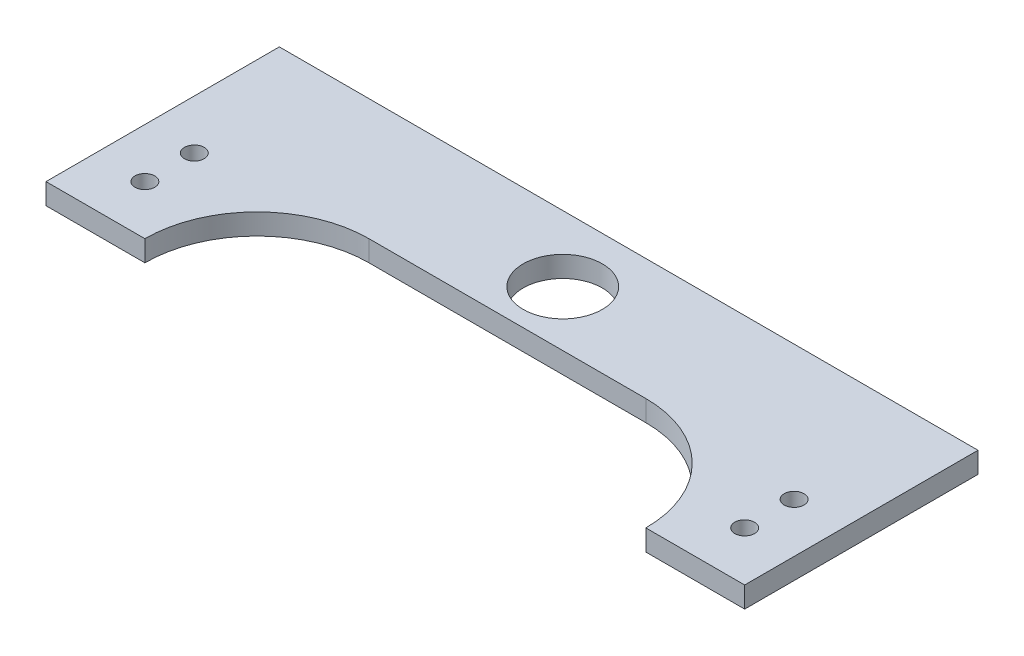
ISO-10303-21;
HEADER;
FILE_DESCRIPTION(('STEP AP214'),'2;1');
FILE_NAME('part.step','',(''),(''),'','','');
FILE_SCHEMA(('AUTOMOTIVE_DESIGN { 1 0 10303 214 1 1 1 1 }'));
ENDSEC;
DATA;
#1=APPLICATION_CONTEXT('core data for automotive mechanical design processes');
#2=APPLICATION_PROTOCOL_DEFINITION('international standard','automotive_design',2000,#1);
#3=PRODUCT_CONTEXT('',#1,'mechanical');
#4=PRODUCT('Part','Part','',(#3));
#5=PRODUCT_RELATED_PRODUCT_CATEGORY('part','',(#4));
#6=PRODUCT_DEFINITION_FORMATION('','',#4);
#7=PRODUCT_DEFINITION_CONTEXT('part definition',#1,'design');
#8=PRODUCT_DEFINITION('design','',#6,#7);
#9=PRODUCT_DEFINITION_SHAPE('','',#8);
#10=(LENGTH_UNIT() NAMED_UNIT(*) SI_UNIT(.MILLI.,.METRE.));
#11=(NAMED_UNIT(*) PLANE_ANGLE_UNIT() SI_UNIT($,.RADIAN.));
#12=(NAMED_UNIT(*) SI_UNIT($,.STERADIAN.) SOLID_ANGLE_UNIT());
#13=UNCERTAINTY_MEASURE_WITH_UNIT(LENGTH_MEASURE(1.E-05),#10,'distance_accuracy_value','');
#14=(GEOMETRIC_REPRESENTATION_CONTEXT(3) GLOBAL_UNCERTAINTY_ASSIGNED_CONTEXT((#13)) GLOBAL_UNIT_ASSIGNED_CONTEXT((#10,
#11,#12)) REPRESENTATION_CONTEXT('',''));
#15=CARTESIAN_POINT('',(0.,0.,0.));
#16=DIRECTION('',(0.,0.,1.));
#17=DIRECTION('',(1.,0.,0.));
#18=AXIS2_PLACEMENT_3D('',#15,#16,#17);
#19=CARTESIAN_POINT('',(0.,3.175,0.));
#20=DIRECTION('',(0.,1.,0.));
#21=DIRECTION('',(0.,0.,1.));
#22=AXIS2_PLACEMENT_3D('',#19,#20,#21);
#23=PLANE('',#22);
#24=CARTESIAN_POINT('',(7.5,3.175,-7.5));
#25=DIRECTION('',(0.,-1.,0.));
#26=DIRECTION('',(0.,0.,-1.));
#27=AXIS2_PLACEMENT_3D('',#24,#25,#26);
#28=CIRCLE('',#27,1.5);
#29=CARTESIAN_POINT('',(7.5,3.175,-9.));
#30=VERTEX_POINT('',#29);
#31=EDGE_CURVE('E378',#30,#30,#28,.T.);
#32=ORIENTED_EDGE('',*,*,#31,.T.);
#33=EDGE_LOOP('',(#32));
#34=FACE_BOUND('',#33,.T.);
#35=CARTESIAN_POINT('',(98.5,3.175,-15.));
#36=DIRECTION('',(0.,-1.,0.));
#37=DIRECTION('',(0.,0.,-1.));
#38=AXIS2_PLACEMENT_3D('',#35,#36,#37);
#39=CIRCLE('',#38,1.5);
#40=CARTESIAN_POINT('',(98.5,3.175,-16.5));
#41=VERTEX_POINT('',#40);
#42=EDGE_CURVE('E397',#41,#41,#39,.F.);
#43=ORIENTED_EDGE('',*,*,#42,.F.);
#44=EDGE_LOOP('',(#43));
#45=FACE_BOUND('',#44,.T.);
#46=CARTESIAN_POINT('',(7.5,3.175,-15.));
#47=DIRECTION('',(0.,-1.,0.));
#48=DIRECTION('',(0.,0.,-1.));
#49=AXIS2_PLACEMENT_3D('',#46,#47,#48);
#50=CIRCLE('',#49,1.5);
#51=CARTESIAN_POINT('',(7.5,3.175,-16.5));
#52=VERTEX_POINT('',#51);
#53=EDGE_CURVE('E136',#52,#52,#50,.T.);
#54=ORIENTED_EDGE('',*,*,#53,.T.);
#55=EDGE_LOOP('',(#54));
#56=FACE_BOUND('',#55,.T.);
#57=DIRECTION('',(1.,0.,0.));
#58=VECTOR('',#57,1.);
#59=CARTESIAN_POINT('',(0.,3.175,-35.4));
#60=LINE('',#59,#58);
#61=CARTESIAN_POINT('',(0.,3.175,-35.4));
#62=VERTEX_POINT('',#61);
#63=CARTESIAN_POINT('',(106.,3.175,-35.4));
#64=VERTEX_POINT('',#63);
#65=EDGE_CURVE('E155',#62,#64,#60,.T.);
#66=ORIENTED_EDGE('',*,*,#65,.F.);
#67=DIRECTION('',(0.,0.,-1.));
#68=VECTOR('',#67,1.);
#69=CARTESIAN_POINT('',(0.,3.175,0.));
#70=LINE('',#69,#68);
#71=CARTESIAN_POINT('',(0.,3.175,0.));
#72=VERTEX_POINT('',#71);
#73=EDGE_CURVE('E178',#72,#62,#70,.T.);
#74=ORIENTED_EDGE('',*,*,#73,.F.);
#75=DIRECTION('',(1.,0.,0.));
#76=VECTOR('',#75,1.);
#77=CARTESIAN_POINT('',(0.,3.175,0.));
#78=LINE('',#77,#76);
#79=CARTESIAN_POINT('',(15.,3.175,0.));
#80=VERTEX_POINT('',#79);
#81=EDGE_CURVE('E167',#72,#80,#78,.T.);
#82=ORIENTED_EDGE('',*,*,#81,.T.);
#83=CARTESIAN_POINT('',(32.,3.175,0.));
#84=DIRECTION('',(0.,1.,0.));
#85=DIRECTION('',(0.,0.,1.));
#86=AXIS2_PLACEMENT_3D('',#83,#84,#85);
#87=CIRCLE('',#86,17.);
#88=CARTESIAN_POINT('',(32.,3.175,-17.));
#89=VERTEX_POINT('',#88);
#90=EDGE_CURVE('E124',#89,#80,#87,.T.);
#91=ORIENTED_EDGE('',*,*,#90,.F.);
#92=DIRECTION('',(1.,0.,0.));
#93=VECTOR('',#92,1.);
#94=CARTESIAN_POINT('',(0.,3.175,-17.));
#95=LINE('',#94,#93);
#96=CARTESIAN_POINT('',(74.,3.175,-17.));
#97=VERTEX_POINT('',#96);
#98=EDGE_CURVE('E121',#89,#97,#95,.T.);
#99=ORIENTED_EDGE('',*,*,#98,.T.);
#100=CARTESIAN_POINT('',(74.,3.175,0.));
#101=DIRECTION('',(0.,1.,0.));
#102=DIRECTION('',(0.,0.,1.));
#103=AXIS2_PLACEMENT_3D('',#100,#101,#102);
#104=CIRCLE('',#103,17.);
#105=CARTESIAN_POINT('',(91.,3.175,0.));
#106=VERTEX_POINT('',#105);
#107=EDGE_CURVE('E109',#106,#97,#104,.T.);
#108=ORIENTED_EDGE('',*,*,#107,.F.);
#109=DIRECTION('',(1.,0.,0.));
#110=VECTOR('',#109,1.);
#111=CARTESIAN_POINT('',(0.,3.175,0.));
#112=LINE('',#111,#110);
#113=CARTESIAN_POINT('',(106.,3.175,0.));
#114=VERTEX_POINT('',#113);
#115=EDGE_CURVE('E115',#106,#114,#112,.T.);
#116=ORIENTED_EDGE('',*,*,#115,.T.);
#117=DIRECTION('',(0.,0.,-1.));
#118=VECTOR('',#117,1.);
#119=CARTESIAN_POINT('',(106.,3.175,0.));
#120=LINE('',#119,#118);
#121=EDGE_CURVE('E51',#114,#64,#120,.T.);
#122=ORIENTED_EDGE('',*,*,#121,.T.);
#123=EDGE_LOOP('',(#66,#74,#82,#91,#99,#108,#116,#122));
#124=FACE_BOUND('',#123,.T.);
#125=CARTESIAN_POINT('',(53.,3.175,-25.4));
#126=DIRECTION('',(0.,1.,0.));
#127=DIRECTION('',(0.,0.,1.));
#128=AXIS2_PLACEMENT_3D('',#125,#126,#127);
#129=CIRCLE('',#128,5.99999999999999);
#130=CARTESIAN_POINT('',(53.,3.175,-19.4));
#131=VERTEX_POINT('',#130);
#132=EDGE_CURVE('E129',#131,#131,#129,.T.);
#133=ORIENTED_EDGE('',*,*,#132,.F.);
#134=EDGE_LOOP('',(#133));
#135=FACE_BOUND('',#134,.T.);
#136=CARTESIAN_POINT('',(98.5,3.175,-7.5));
#137=DIRECTION('',(0.,-1.,0.));
#138=DIRECTION('',(0.,0.,-1.));
#139=AXIS2_PLACEMENT_3D('',#136,#137,#138);
#140=CIRCLE('',#139,1.5);
#141=CARTESIAN_POINT('',(98.5,3.175,-9.));
#142=VERTEX_POINT('',#141);
#143=EDGE_CURVE('E382',#142,#142,#140,.F.);
#144=ORIENTED_EDGE('',*,*,#143,.F.);
#145=EDGE_LOOP('',(#144));
#146=FACE_BOUND('',#145,.T.);
#147=ADVANCED_FACE('F34',(#34,#45,#56,#124,#135,#146),#23,.T.);
#148=CARTESIAN_POINT('',(0.,0.,0.));
#149=DIRECTION('',(0.,1.,0.));
#150=DIRECTION('',(0.,0.,1.));
#151=AXIS2_PLACEMENT_3D('',#148,#149,#150);
#152=PLANE('',#151);
#153=CARTESIAN_POINT('',(7.5,0.,-7.5));
#154=DIRECTION('',(0.,-1.,0.));
#155=DIRECTION('',(0.,0.,-1.));
#156=AXIS2_PLACEMENT_3D('',#153,#154,#155);
#157=CIRCLE('',#156,1.5);
#158=CARTESIAN_POINT('',(7.5,0.,-9.));
#159=VERTEX_POINT('',#158);
#160=EDGE_CURVE('E381',#159,#159,#157,.T.);
#161=ORIENTED_EDGE('',*,*,#160,.F.);
#162=EDGE_LOOP('',(#161));
#163=FACE_BOUND('',#162,.T.);
#164=CARTESIAN_POINT('',(7.5,0.,-15.));
#165=DIRECTION('',(0.,-1.,0.));
#166=DIRECTION('',(0.,0.,-1.));
#167=AXIS2_PLACEMENT_3D('',#164,#165,#166);
#168=CIRCLE('',#167,1.5);
#169=CARTESIAN_POINT('',(7.5,0.,-16.5));
#170=VERTEX_POINT('',#169);
#171=EDGE_CURVE('E185',#170,#170,#168,.T.);
#172=ORIENTED_EDGE('',*,*,#171,.F.);
#173=EDGE_LOOP('',(#172));
#174=FACE_BOUND('',#173,.T.);
#175=DIRECTION('',(1.,0.,0.));
#176=VECTOR('',#175,1.);
#177=CARTESIAN_POINT('',(0.,0.,-35.4));
#178=LINE('',#177,#176);
#179=CARTESIAN_POINT('',(0.,0.,-35.4));
#180=VERTEX_POINT('',#179);
#181=CARTESIAN_POINT('',(106.,0.,-35.4));
#182=VERTEX_POINT('',#181);
#183=EDGE_CURVE('E132',#180,#182,#178,.T.);
#184=ORIENTED_EDGE('',*,*,#183,.T.);
#185=DIRECTION('',(0.,0.,-1.));
#186=VECTOR('',#185,1.);
#187=CARTESIAN_POINT('',(106.,0.,0.));
#188=LINE('',#187,#186);
#189=CARTESIAN_POINT('',(106.,0.,0.));
#190=VERTEX_POINT('',#189);
#191=EDGE_CURVE('E150',#190,#182,#188,.T.);
#192=ORIENTED_EDGE('',*,*,#191,.F.);
#193=DIRECTION('',(1.,0.,0.));
#194=VECTOR('',#193,1.);
#195=CARTESIAN_POINT('',(0.,0.,0.));
#196=LINE('',#195,#194);
#197=CARTESIAN_POINT('',(91.,0.,0.));
#198=VERTEX_POINT('',#197);
#199=EDGE_CURVE('E78',#198,#190,#196,.T.);
#200=ORIENTED_EDGE('',*,*,#199,.F.);
#201=CARTESIAN_POINT('',(74.,0.,0.));
#202=DIRECTION('',(0.,1.,0.));
#203=DIRECTION('',(0.,0.,1.));
#204=AXIS2_PLACEMENT_3D('',#201,#202,#203);
#205=CIRCLE('',#204,17.);
#206=CARTESIAN_POINT('',(74.,0.,-17.));
#207=VERTEX_POINT('',#206);
#208=EDGE_CURVE('E111',#198,#207,#205,.T.);
#209=ORIENTED_EDGE('',*,*,#208,.T.);
#210=DIRECTION('',(1.,0.,0.));
#211=VECTOR('',#210,1.);
#212=CARTESIAN_POINT('',(0.,0.,-17.));
#213=LINE('',#212,#211);
#214=CARTESIAN_POINT('',(32.,0.,-17.));
#215=VERTEX_POINT('',#214);
#216=EDGE_CURVE('E145',#215,#207,#213,.T.);
#217=ORIENTED_EDGE('',*,*,#216,.F.);
#218=CARTESIAN_POINT('',(32.,0.,0.));
#219=DIRECTION('',(0.,1.,0.));
#220=DIRECTION('',(0.,0.,1.));
#221=AXIS2_PLACEMENT_3D('',#218,#219,#220);
#222=CIRCLE('',#221,17.);
#223=CARTESIAN_POINT('',(15.,0.,0.));
#224=VERTEX_POINT('',#223);
#225=EDGE_CURVE('E142',#215,#224,#222,.T.);
#226=ORIENTED_EDGE('',*,*,#225,.T.);
#227=DIRECTION('',(1.,0.,0.));
#228=VECTOR('',#227,1.);
#229=CARTESIAN_POINT('',(0.,0.,0.));
#230=LINE('',#229,#228);
#231=CARTESIAN_POINT('',(0.,0.,0.));
#232=VERTEX_POINT('',#231);
#233=EDGE_CURVE('E139',#232,#224,#230,.T.);
#234=ORIENTED_EDGE('',*,*,#233,.F.);
#235=DIRECTION('',(0.,0.,-1.));
#236=VECTOR('',#235,1.);
#237=CARTESIAN_POINT('',(0.,0.,0.));
#238=LINE('',#237,#236);
#239=EDGE_CURVE('E135',#232,#180,#238,.T.);
#240=ORIENTED_EDGE('',*,*,#239,.T.);
#241=EDGE_LOOP('',(#184,#192,#200,#209,#217,#226,#234,#240));
#242=FACE_BOUND('',#241,.T.);
#243=CARTESIAN_POINT('',(53.,0.,-25.4));
#244=DIRECTION('',(0.,1.,0.));
#245=DIRECTION('',(0.,0.,1.));
#246=AXIS2_PLACEMENT_3D('',#243,#244,#245);
#247=CIRCLE('',#246,5.99999999999999);
#248=CARTESIAN_POINT('',(53.,0.,-19.4));
#249=VERTEX_POINT('',#248);
#250=EDGE_CURVE('E152',#249,#249,#247,.T.);
#251=ORIENTED_EDGE('',*,*,#250,.T.);
#252=EDGE_LOOP('',(#251));
#253=FACE_BOUND('',#252,.T.);
#254=CARTESIAN_POINT('',(98.5,0.,-15.));
#255=DIRECTION('',(0.,-1.,0.));
#256=DIRECTION('',(0.,0.,-1.));
#257=AXIS2_PLACEMENT_3D('',#254,#255,#256);
#258=CIRCLE('',#257,1.5);
#259=CARTESIAN_POINT('',(98.5,0.,-16.5));
#260=VERTEX_POINT('',#259);
#261=EDGE_CURVE('E393',#260,#260,#258,.F.);
#262=ORIENTED_EDGE('',*,*,#261,.T.);
#263=EDGE_LOOP('',(#262));
#264=FACE_BOUND('',#263,.T.);
#265=CARTESIAN_POINT('',(98.5,0.,-7.5));
#266=DIRECTION('',(0.,-1.,0.));
#267=DIRECTION('',(0.,0.,-1.));
#268=AXIS2_PLACEMENT_3D('',#265,#266,#267);
#269=CIRCLE('',#268,1.5);
#270=CARTESIAN_POINT('',(98.5,0.,-9.));
#271=VERTEX_POINT('',#270);
#272=EDGE_CURVE('E385',#271,#271,#269,.F.);
#273=ORIENTED_EDGE('',*,*,#272,.T.);
#274=EDGE_LOOP('',(#273));
#275=FACE_BOUND('',#274,.T.);
#276=ADVANCED_FACE('F173',(#163,#174,#242,#253,#264,#275),#152,.F.);
#277=CARTESIAN_POINT('',(0.,3.175,-35.4));
#278=DIRECTION('',(0.,0.,-1.));
#279=DIRECTION('',(-1.,0.,0.));
#280=AXIS2_PLACEMENT_3D('',#277,#278,#279);
#281=PLANE('',#280);
#282=ORIENTED_EDGE('',*,*,#183,.F.);
#283=DIRECTION('',(0.,-1.,0.));
#284=VECTOR('',#283,1.);
#285=CARTESIAN_POINT('',(0.,3.175,-35.4));
#286=LINE('',#285,#284);
#287=EDGE_CURVE('E11',#62,#180,#286,.T.);
#288=ORIENTED_EDGE('',*,*,#287,.F.);
#289=ORIENTED_EDGE('',*,*,#65,.T.);
#290=DIRECTION('',(0.,-1.,0.));
#291=VECTOR('',#290,1.);
#292=CARTESIAN_POINT('',(106.,3.175,-35.4));
#293=LINE('',#292,#291);
#294=EDGE_CURVE('E85',#64,#182,#293,.T.);
#295=ORIENTED_EDGE('',*,*,#294,.T.);
#296=EDGE_LOOP('',(#282,#288,#289,#295));
#297=FACE_BOUND('',#296,.T.);
#298=ADVANCED_FACE('F36',(#297),#281,.T.);
#299=CARTESIAN_POINT('',(0.,3.175,0.));
#300=DIRECTION('',(-1.,0.,0.));
#301=DIRECTION('',(0.,0.,1.));
#302=AXIS2_PLACEMENT_3D('',#299,#300,#301);
#303=PLANE('',#302);
#304=ORIENTED_EDGE('',*,*,#239,.F.);
#305=DIRECTION('',(0.,-1.,0.));
#306=VECTOR('',#305,1.);
#307=CARTESIAN_POINT('',(0.,3.175,0.));
#308=LINE('',#307,#306);
#309=EDGE_CURVE('E43',#72,#232,#308,.T.);
#310=ORIENTED_EDGE('',*,*,#309,.F.);
#311=ORIENTED_EDGE('',*,*,#73,.T.);
#312=ORIENTED_EDGE('',*,*,#287,.T.);
#313=EDGE_LOOP('',(#304,#310,#311,#312));
#314=FACE_BOUND('',#313,.T.);
#315=ADVANCED_FACE('F177',(#314),#303,.T.);
#316=CARTESIAN_POINT('',(0.,3.175,0.));
#317=DIRECTION('',(0.,0.,-1.));
#318=DIRECTION('',(-1.,0.,0.));
#319=AXIS2_PLACEMENT_3D('',#316,#317,#318);
#320=PLANE('',#319);
#321=ORIENTED_EDGE('',*,*,#233,.T.);
#322=DIRECTION('',(0.,-1.,0.));
#323=VECTOR('',#322,1.);
#324=CARTESIAN_POINT('',(15.,3.175,0.));
#325=LINE('',#324,#323);
#326=EDGE_CURVE('E161',#80,#224,#325,.T.);
#327=ORIENTED_EDGE('',*,*,#326,.F.);
#328=ORIENTED_EDGE('',*,*,#81,.F.);
#329=ORIENTED_EDGE('',*,*,#309,.T.);
#330=EDGE_LOOP('',(#321,#327,#328,#329));
#331=FACE_BOUND('',#330,.T.);
#332=ADVANCED_FACE('F165',(#331),#320,.F.);
#333=CARTESIAN_POINT('',(32.,3.175,0.));
#334=DIRECTION('',(0.,-1.,0.));
#335=DIRECTION('',(0.,0.,-1.));
#336=AXIS2_PLACEMENT_3D('',#333,#334,#335);
#337=CYLINDRICAL_SURFACE('',#336,17.);
#338=ORIENTED_EDGE('',*,*,#225,.F.);
#339=DIRECTION('',(0.,-1.,0.));
#340=VECTOR('',#339,1.);
#341=CARTESIAN_POINT('',(32.,3.175,-17.));
#342=LINE('',#341,#340);
#343=EDGE_CURVE('E159',#89,#215,#342,.T.);
#344=ORIENTED_EDGE('',*,*,#343,.F.);
#345=ORIENTED_EDGE('',*,*,#90,.T.);
#346=ORIENTED_EDGE('',*,*,#326,.T.);
#347=EDGE_LOOP('',(#338,#344,#345,#346));
#348=FACE_BOUND('',#347,.T.);
#349=ADVANCED_FACE('F190',(#348),#337,.F.);
#350=CARTESIAN_POINT('',(0.,3.175,-17.));
#351=DIRECTION('',(0.,0.,-1.));
#352=DIRECTION('',(-1.,0.,0.));
#353=AXIS2_PLACEMENT_3D('',#350,#351,#352);
#354=PLANE('',#353);
#355=ORIENTED_EDGE('',*,*,#216,.T.);
#356=DIRECTION('',(0.,-1.,0.));
#357=VECTOR('',#356,1.);
#358=CARTESIAN_POINT('',(74.,3.175,-17.));
#359=LINE('',#358,#357);
#360=EDGE_CURVE('E112',#97,#207,#359,.T.);
#361=ORIENTED_EDGE('',*,*,#360,.F.);
#362=ORIENTED_EDGE('',*,*,#98,.F.);
#363=ORIENTED_EDGE('',*,*,#343,.T.);
#364=EDGE_LOOP('',(#355,#361,#362,#363));
#365=FACE_BOUND('',#364,.T.);
#366=ADVANCED_FACE('F192',(#365),#354,.F.);
#367=CARTESIAN_POINT('',(74.,3.175,0.));
#368=DIRECTION('',(0.,-1.,0.));
#369=DIRECTION('',(0.,0.,-1.));
#370=AXIS2_PLACEMENT_3D('',#367,#368,#369);
#371=CYLINDRICAL_SURFACE('',#370,17.);
#372=ORIENTED_EDGE('',*,*,#208,.F.);
#373=DIRECTION('',(0.,-1.,0.));
#374=VECTOR('',#373,1.);
#375=CARTESIAN_POINT('',(91.,3.175,0.));
#376=LINE('',#375,#374);
#377=EDGE_CURVE('E105',#106,#198,#376,.T.);
#378=ORIENTED_EDGE('',*,*,#377,.F.);
#379=ORIENTED_EDGE('',*,*,#107,.T.);
#380=ORIENTED_EDGE('',*,*,#360,.T.);
#381=EDGE_LOOP('',(#372,#378,#379,#380));
#382=FACE_BOUND('',#381,.T.);
#383=ADVANCED_FACE('F107',(#382),#371,.F.);
#384=CARTESIAN_POINT('',(0.,3.175,0.));
#385=DIRECTION('',(0.,0.,-1.));
#386=DIRECTION('',(-1.,0.,0.));
#387=AXIS2_PLACEMENT_3D('',#384,#385,#386);
#388=PLANE('',#387);
#389=ORIENTED_EDGE('',*,*,#199,.T.);
#390=DIRECTION('',(0.,-1.,0.));
#391=VECTOR('',#390,1.);
#392=CARTESIAN_POINT('',(106.,3.175,0.));
#393=LINE('',#392,#391);
#394=EDGE_CURVE('E113',#114,#190,#393,.T.);
#395=ORIENTED_EDGE('',*,*,#394,.F.);
#396=ORIENTED_EDGE('',*,*,#115,.F.);
#397=ORIENTED_EDGE('',*,*,#377,.T.);
#398=EDGE_LOOP('',(#389,#395,#396,#397));
#399=FACE_BOUND('',#398,.T.);
#400=ADVANCED_FACE('F116',(#399),#388,.F.);
#401=CARTESIAN_POINT('',(106.,3.175,0.));
#402=DIRECTION('',(-1.,0.,0.));
#403=DIRECTION('',(0.,0.,1.));
#404=AXIS2_PLACEMENT_3D('',#401,#402,#403);
#405=PLANE('',#404);
#406=ORIENTED_EDGE('',*,*,#191,.T.);
#407=ORIENTED_EDGE('',*,*,#294,.F.);
#408=ORIENTED_EDGE('',*,*,#121,.F.);
#409=ORIENTED_EDGE('',*,*,#394,.T.);
#410=EDGE_LOOP('',(#406,#407,#408,#409));
#411=FACE_BOUND('',#410,.T.);
#412=ADVANCED_FACE('F181',(#411),#405,.F.);
#413=CARTESIAN_POINT('',(53.,3.175,-25.4));
#414=DIRECTION('',(0.,-1.,0.));
#415=DIRECTION('',(0.,0.,-1.));
#416=AXIS2_PLACEMENT_3D('',#413,#414,#415);
#417=CYLINDRICAL_SURFACE('',#416,5.99999999999999);
#418=ORIENTED_EDGE('',*,*,#132,.T.);
#419=EDGE_LOOP('',(#418));
#420=FACE_BOUND('',#419,.T.);
#421=ORIENTED_EDGE('',*,*,#250,.F.);
#422=EDGE_LOOP('',(#421));
#423=FACE_BOUND('',#422,.T.);
#424=ADVANCED_FACE('F215',(#420,#423),#417,.F.);
#425=CARTESIAN_POINT('',(7.5,3.175,-15.));
#426=DIRECTION('',(0.,-1.,0.));
#427=DIRECTION('',(0.,0.,-1.));
#428=AXIS2_PLACEMENT_3D('',#425,#426,#427);
#429=CYLINDRICAL_SURFACE('',#428,1.5);
#430=ORIENTED_EDGE('',*,*,#53,.F.);
#431=EDGE_LOOP('',(#430));
#432=FACE_BOUND('',#431,.T.);
#433=ORIENTED_EDGE('',*,*,#171,.T.);
#434=EDGE_LOOP('',(#433));
#435=FACE_BOUND('',#434,.T.);
#436=ADVANCED_FACE('F212',(#432,#435),#429,.F.);
#437=CARTESIAN_POINT('',(98.5,3.175,-15.));
#438=DIRECTION('',(0.,-1.,0.));
#439=DIRECTION('',(0.,0.,-1.));
#440=AXIS2_PLACEMENT_3D('',#437,#438,#439);
#441=CYLINDRICAL_SURFACE('',#440,1.5);
#442=ORIENTED_EDGE('',*,*,#42,.T.);
#443=EDGE_LOOP('',(#442));
#444=FACE_BOUND('',#443,.T.);
#445=ORIENTED_EDGE('',*,*,#261,.F.);
#446=EDGE_LOOP('',(#445));
#447=FACE_BOUND('',#446,.T.);
#448=ADVANCED_FACE('F240',(#444,#447),#441,.F.);
#449=CARTESIAN_POINT('',(98.5,3.175,-7.5));
#450=DIRECTION('',(0.,-1.,0.));
#451=DIRECTION('',(0.,0.,-1.));
#452=AXIS2_PLACEMENT_3D('',#449,#450,#451);
#453=CYLINDRICAL_SURFACE('',#452,1.5);
#454=ORIENTED_EDGE('',*,*,#143,.T.);
#455=EDGE_LOOP('',(#454));
#456=FACE_BOUND('',#455,.T.);
#457=ORIENTED_EDGE('',*,*,#272,.F.);
#458=EDGE_LOOP('',(#457));
#459=FACE_BOUND('',#458,.T.);
#460=ADVANCED_FACE('F248',(#456,#459),#453,.F.);
#461=CARTESIAN_POINT('',(7.5,3.175,-7.5));
#462=DIRECTION('',(0.,-1.,0.));
#463=DIRECTION('',(0.,0.,-1.));
#464=AXIS2_PLACEMENT_3D('',#461,#462,#463);
#465=CYLINDRICAL_SURFACE('',#464,1.5);
#466=ORIENTED_EDGE('',*,*,#31,.F.);
#467=EDGE_LOOP('',(#466));
#468=FACE_BOUND('',#467,.T.);
#469=ORIENTED_EDGE('',*,*,#160,.T.);
#470=EDGE_LOOP('',(#469));
#471=FACE_BOUND('',#470,.T.);
#472=ADVANCED_FACE('F256',(#468,#471),#465,.F.);
#473=CLOSED_SHELL('',(#147,#276,#298,#315,#332,#349,#366,#383,#400,#412,#424,#436,#448,#460,#472));
#474=MANIFOLD_SOLID_BREP('B2',#473);
#475=ADVANCED_BREP_SHAPE_REPRESENTATION('',(#18,#474),#14);
#476=SHAPE_DEFINITION_REPRESENTATION(#9,#475);
ENDSEC;
END-ISO-10303-21;
